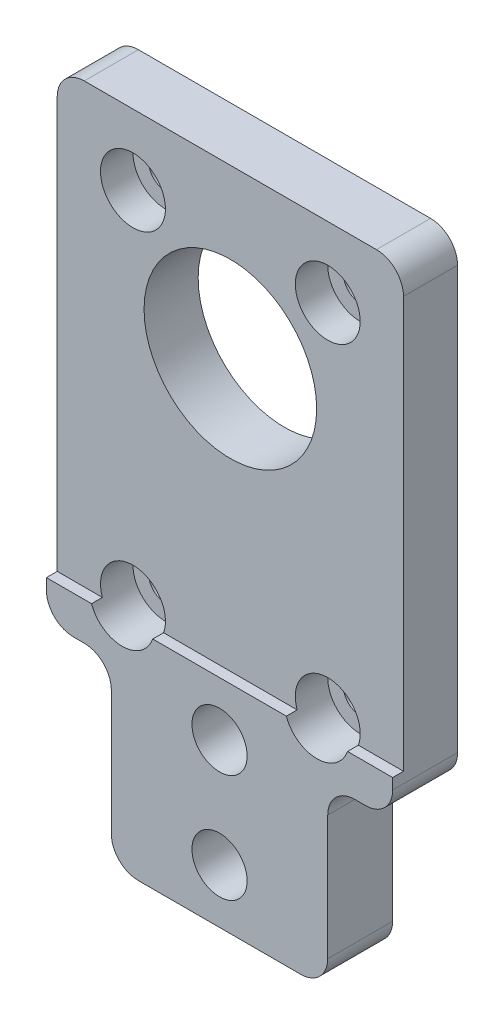
ISO-10303-21;
HEADER;
FILE_DESCRIPTION(('STEP AP214'),'2;1');
FILE_NAME('part.step','',(''),(''),'','','');
FILE_SCHEMA(('AUTOMOTIVE_DESIGN { 1 0 10303 214 1 1 1 1 }'));
ENDSEC;
DATA;
#1=APPLICATION_CONTEXT('core data for automotive mechanical design processes');
#2=APPLICATION_PROTOCOL_DEFINITION('international standard','automotive_design',2000,#1);
#3=PRODUCT_CONTEXT('',#1,'mechanical');
#4=PRODUCT('Part','Part','',(#3));
#5=PRODUCT_RELATED_PRODUCT_CATEGORY('part','',(#4));
#6=PRODUCT_DEFINITION_FORMATION('','',#4);
#7=PRODUCT_DEFINITION_CONTEXT('part definition',#1,'design');
#8=PRODUCT_DEFINITION('design','',#6,#7);
#9=PRODUCT_DEFINITION_SHAPE('','',#8);
#10=(LENGTH_UNIT() NAMED_UNIT(*) SI_UNIT(.MILLI.,.METRE.));
#11=(NAMED_UNIT(*) PLANE_ANGLE_UNIT() SI_UNIT($,.RADIAN.));
#12=(NAMED_UNIT(*) SI_UNIT($,.STERADIAN.) SOLID_ANGLE_UNIT());
#13=UNCERTAINTY_MEASURE_WITH_UNIT(LENGTH_MEASURE(1.E-05),#10,'distance_accuracy_value','');
#14=(GEOMETRIC_REPRESENTATION_CONTEXT(3) GLOBAL_UNCERTAINTY_ASSIGNED_CONTEXT((#13)) GLOBAL_UNIT_ASSIGNED_CONTEXT((#10,
#11,#12)) REPRESENTATION_CONTEXT('',''));
#15=CARTESIAN_POINT('',(0.,0.,0.));
#16=DIRECTION('',(0.,0.,1.));
#17=DIRECTION('',(1.,0.,0.));
#18=AXIS2_PLACEMENT_3D('',#15,#16,#17);
#19=CARTESIAN_POINT('',(-9.00000000000001,6.,0.));
#20=DIRECTION('',(0.,0.,1.));
#21=DIRECTION('',(1.,0.,0.));
#22=AXIS2_PLACEMENT_3D('',#19,#20,#21);
#23=CYLINDRICAL_SURFACE('',#22,1.55);
#24=CARTESIAN_POINT('',(-9.00000000000001,6.,0.));
#25=DIRECTION('',(0.,0.,1.));
#26=DIRECTION('',(1.,0.,0.));
#27=AXIS2_PLACEMENT_3D('',#24,#25,#26);
#28=CIRCLE('',#27,1.55);
#29=CARTESIAN_POINT('',(-7.45000000000001,6.,0.));
#30=VERTEX_POINT('',#29);
#31=EDGE_CURVE('E286',#30,#30,#28,.T.);
#32=ORIENTED_EDGE('',*,*,#31,.F.);
#33=EDGE_LOOP('',(#32));
#34=FACE_BOUND('',#33,.T.);
#35=CARTESIAN_POINT('',(-9.00000000000001,6.,2.));
#36=DIRECTION('',(0.,0.,1.));
#37=DIRECTION('',(1.,0.,0.));
#38=AXIS2_PLACEMENT_3D('',#35,#36,#37);
#39=CIRCLE('',#38,1.55);
#40=CARTESIAN_POINT('',(-7.45000000000001,6.,2.));
#41=VERTEX_POINT('',#40);
#42=EDGE_CURVE('E37',#41,#41,#39,.F.);
#43=ORIENTED_EDGE('',*,*,#42,.F.);
#44=EDGE_LOOP('',(#43));
#45=FACE_BOUND('',#44,.T.);
#46=ADVANCED_FACE('F33',(#34,#45),#23,.F.);
#47=CARTESIAN_POINT('',(8.9999999999999,6.,0.));
#48=DIRECTION('',(0.,0.,1.));
#49=DIRECTION('',(1.,0.,0.));
#50=AXIS2_PLACEMENT_3D('',#47,#48,#49);
#51=CYLINDRICAL_SURFACE('',#50,1.55);
#52=CARTESIAN_POINT('',(8.9999999999999,6.,0.));
#53=DIRECTION('',(0.,0.,1.));
#54=DIRECTION('',(1.,0.,0.));
#55=AXIS2_PLACEMENT_3D('',#52,#53,#54);
#56=CIRCLE('',#55,1.55);
#57=CARTESIAN_POINT('',(10.5499999999999,6.,0.));
#58=VERTEX_POINT('',#57);
#59=EDGE_CURVE('E289',#58,#58,#56,.T.);
#60=ORIENTED_EDGE('',*,*,#59,.F.);
#61=EDGE_LOOP('',(#60));
#62=FACE_BOUND('',#61,.T.);
#63=CARTESIAN_POINT('',(8.9999999999999,6.,2.));
#64=DIRECTION('',(0.,0.,1.));
#65=DIRECTION('',(1.,0.,0.));
#66=AXIS2_PLACEMENT_3D('',#63,#64,#65);
#67=CIRCLE('',#66,1.55);
#68=CARTESIAN_POINT('',(10.5499999999999,6.,2.));
#69=VERTEX_POINT('',#68);
#70=EDGE_CURVE('E236',#69,#69,#67,.F.);
#71=ORIENTED_EDGE('',*,*,#70,.F.);
#72=EDGE_LOOP('',(#71));
#73=FACE_BOUND('',#72,.T.);
#74=ADVANCED_FACE('F519',(#62,#73),#51,.F.);
#75=CARTESIAN_POINT('',(9.,38.9999999999999,0.));
#76=DIRECTION('',(0.,0.,1.));
#77=DIRECTION('',(1.,0.,0.));
#78=AXIS2_PLACEMENT_3D('',#75,#76,#77);
#79=CYLINDRICAL_SURFACE('',#78,1.55);
#80=CARTESIAN_POINT('',(9.,38.9999999999999,0.));
#81=DIRECTION('',(0.,0.,1.));
#82=DIRECTION('',(1.,0.,0.));
#83=AXIS2_PLACEMENT_3D('',#80,#81,#82);
#84=CIRCLE('',#83,1.55);
#85=CARTESIAN_POINT('',(10.55,38.9999999999999,0.));
#86=VERTEX_POINT('',#85);
#87=EDGE_CURVE('E292',#86,#86,#84,.T.);
#88=ORIENTED_EDGE('',*,*,#87,.F.);
#89=EDGE_LOOP('',(#88));
#90=FACE_BOUND('',#89,.T.);
#91=CARTESIAN_POINT('',(9.,38.9999999999999,2.));
#92=DIRECTION('',(0.,0.,1.));
#93=DIRECTION('',(1.,0.,0.));
#94=AXIS2_PLACEMENT_3D('',#91,#92,#93);
#95=CIRCLE('',#94,1.55);
#96=CARTESIAN_POINT('',(10.55,38.9999999999999,2.));
#97=VERTEX_POINT('',#96);
#98=EDGE_CURVE('E230',#97,#97,#95,.F.);
#99=ORIENTED_EDGE('',*,*,#98,.F.);
#100=EDGE_LOOP('',(#99));
#101=FACE_BOUND('',#100,.T.);
#102=ADVANCED_FACE('F525',(#90,#101),#79,.F.);
#103=CARTESIAN_POINT('',(-9.,39.,0.));
#104=DIRECTION('',(0.,0.,1.));
#105=DIRECTION('',(1.,0.,0.));
#106=AXIS2_PLACEMENT_3D('',#103,#104,#105);
#107=CYLINDRICAL_SURFACE('',#106,1.55);
#108=CARTESIAN_POINT('',(-9.,39.,0.));
#109=DIRECTION('',(0.,0.,1.));
#110=DIRECTION('',(1.,0.,0.));
#111=AXIS2_PLACEMENT_3D('',#108,#109,#110);
#112=CIRCLE('',#111,1.55);
#113=CARTESIAN_POINT('',(-7.45,39.,0.));
#114=VERTEX_POINT('',#113);
#115=EDGE_CURVE('E295',#114,#114,#112,.T.);
#116=ORIENTED_EDGE('',*,*,#115,.F.);
#117=EDGE_LOOP('',(#116));
#118=FACE_BOUND('',#117,.T.);
#119=CARTESIAN_POINT('',(-9.,39.,2.));
#120=DIRECTION('',(0.,0.,1.));
#121=DIRECTION('',(1.,0.,0.));
#122=AXIS2_PLACEMENT_3D('',#119,#120,#121);
#123=CIRCLE('',#122,1.55);
#124=CARTESIAN_POINT('',(-7.45,39.,2.));
#125=VERTEX_POINT('',#124);
#126=EDGE_CURVE('E212',#125,#125,#123,.F.);
#127=ORIENTED_EDGE('',*,*,#126,.F.);
#128=EDGE_LOOP('',(#127));
#129=FACE_BOUND('',#128,.T.);
#130=ADVANCED_FACE('F535',(#118,#129),#107,.F.);
#131=CARTESIAN_POINT('',(0.,30.,6.));
#132=DIRECTION('',(0.,0.,1.));
#133=DIRECTION('',(1.,0.,0.));
#134=AXIS2_PLACEMENT_3D('',#131,#132,#133);
#135=PLANE('',#134);
#136=CARTESIAN_POINT('',(0.,0.,6.));
#137=DIRECTION('',(0.,0.,1.));
#138=DIRECTION('',(1.,0.,0.));
#139=AXIS2_PLACEMENT_3D('',#136,#137,#138);
#140=CIRCLE('',#139,2.55);
#141=CARTESIAN_POINT('',(2.55,0.,6.));
#142=VERTEX_POINT('',#141);
#143=EDGE_CURVE('E329',#142,#142,#140,.T.);
#144=ORIENTED_EDGE('',*,*,#143,.F.);
#145=EDGE_LOOP('',(#144));
#146=FACE_BOUND('',#145,.T.);
#147=CARTESIAN_POINT('',(-9.00000000000001,6.,6.));
#148=DIRECTION('',(0.,0.,1.));
#149=DIRECTION('',(1.,0.,0.));
#150=AXIS2_PLACEMENT_3D('',#147,#148,#149);
#151=CIRCLE('',#150,3.);
#152=CARTESIAN_POINT('',(-11.8284271247462,5.,6.));
#153=VERTEX_POINT('',#152);
#154=CARTESIAN_POINT('',(-6.17157287525382,5.,6.));
#155=VERTEX_POINT('',#154);
#156=EDGE_CURVE('E184',#153,#155,#151,.T.);
#157=ORIENTED_EDGE('',*,*,#156,.F.);
#158=DIRECTION('',(1.,0.,0.));
#159=VECTOR('',#158,1.);
#160=CARTESIAN_POINT('',(-30.,5.,6.));
#161=LINE('',#160,#159);
#162=CARTESIAN_POINT('',(-16.,5.,6.));
#163=VERTEX_POINT('',#162);
#164=EDGE_CURVE('E197',#163,#153,#161,.T.);
#165=ORIENTED_EDGE('',*,*,#164,.F.);
#166=DIRECTION('',(0.,1.,0.));
#167=VECTOR('',#166,1.);
#168=CARTESIAN_POINT('',(-16.,45.5,6.));
#169=LINE('',#168,#167);
#170=CARTESIAN_POINT('',(-16.,4.,6.));
#171=VERTEX_POINT('',#170);
#172=EDGE_CURVE('E309',#171,#163,#169,.T.);
#173=ORIENTED_EDGE('',*,*,#172,.F.);
#174=CARTESIAN_POINT('',(-13.5,4.,6.));
#175=DIRECTION('',(0.,0.,1.));
#176=DIRECTION('',(1.,0.,0.));
#177=AXIS2_PLACEMENT_3D('',#174,#175,#176);
#178=CIRCLE('',#177,2.5);
#179=CARTESIAN_POINT('',(-13.5,1.5,6.));
#180=VERTEX_POINT('',#179);
#181=EDGE_CURVE('E377',#171,#180,#178,.T.);
#182=ORIENTED_EDGE('',*,*,#181,.T.);
#183=DIRECTION('',(-1.,0.,0.));
#184=VECTOR('',#183,1.);
#185=CARTESIAN_POINT('',(16.,1.5,6.));
#186=LINE('',#185,#184);
#187=CARTESIAN_POINT('',(-12.5,1.5,6.));
#188=VERTEX_POINT('',#187);
#189=EDGE_CURVE('E304',#188,#180,#186,.T.);
#190=ORIENTED_EDGE('',*,*,#189,.F.);
#191=CARTESIAN_POINT('',(-12.5,-0.999999999999999,6.));
#192=DIRECTION('',(0.,0.,1.));
#193=DIRECTION('',(1.,0.,0.));
#194=AXIS2_PLACEMENT_3D('',#191,#192,#193);
#195=CIRCLE('',#194,2.5);
#196=CARTESIAN_POINT('',(-10.,-1.,6.));
#197=VERTEX_POINT('',#196);
#198=EDGE_CURVE('E235',#188,#197,#195,.F.);
#199=ORIENTED_EDGE('',*,*,#198,.T.);
#200=DIRECTION('',(0.,-1.,0.));
#201=VECTOR('',#200,1.);
#202=CARTESIAN_POINT('',(-10.,-15.,6.));
#203=LINE('',#202,#201);
#204=CARTESIAN_POINT('',(-10.,-12.5,6.));
#205=VERTEX_POINT('',#204);
#206=EDGE_CURVE('E335',#197,#205,#203,.T.);
#207=ORIENTED_EDGE('',*,*,#206,.T.);
#208=CARTESIAN_POINT('',(-7.5,-12.5,6.));
#209=DIRECTION('',(0.,0.,1.));
#210=DIRECTION('',(1.,0.,0.));
#211=AXIS2_PLACEMENT_3D('',#208,#209,#210);
#212=CIRCLE('',#211,2.5);
#213=CARTESIAN_POINT('',(-7.5,-15.,6.));
#214=VERTEX_POINT('',#213);
#215=EDGE_CURVE('E375',#205,#214,#212,.T.);
#216=ORIENTED_EDGE('',*,*,#215,.T.);
#217=DIRECTION('',(1.,0.,0.));
#218=VECTOR('',#217,1.);
#219=CARTESIAN_POINT('',(10.,-15.,6.));
#220=LINE('',#219,#218);
#221=CARTESIAN_POINT('',(7.5,-15.,6.));
#222=VERTEX_POINT('',#221);
#223=EDGE_CURVE('E338',#214,#222,#220,.T.);
#224=ORIENTED_EDGE('',*,*,#223,.T.);
#225=CARTESIAN_POINT('',(7.5,-12.5,6.));
#226=DIRECTION('',(0.,0.,1.));
#227=DIRECTION('',(1.,0.,0.));
#228=AXIS2_PLACEMENT_3D('',#225,#226,#227);
#229=CIRCLE('',#228,2.5);
#230=CARTESIAN_POINT('',(10.,-12.5,6.));
#231=VERTEX_POINT('',#230);
#232=EDGE_CURVE('E379',#222,#231,#229,.T.);
#233=ORIENTED_EDGE('',*,*,#232,.T.);
#234=DIRECTION('',(0.,1.,0.));
#235=VECTOR('',#234,1.);
#236=CARTESIAN_POINT('',(10.,-15.,6.));
#237=LINE('',#236,#235);
#238=CARTESIAN_POINT('',(10.,-0.999999999999999,6.));
#239=VERTEX_POINT('',#238);
#240=EDGE_CURVE('E342',#231,#239,#237,.T.);
#241=ORIENTED_EDGE('',*,*,#240,.T.);
#242=CARTESIAN_POINT('',(12.5,-0.999999999999999,6.));
#243=DIRECTION('',(0.,0.,1.));
#244=DIRECTION('',(1.,0.,0.));
#245=AXIS2_PLACEMENT_3D('',#242,#243,#244);
#246=CIRCLE('',#245,2.5);
#247=CARTESIAN_POINT('',(12.5,1.5,6.));
#248=VERTEX_POINT('',#247);
#249=EDGE_CURVE('E413',#239,#248,#246,.F.);
#250=ORIENTED_EDGE('',*,*,#249,.T.);
#251=CARTESIAN_POINT('',(13.5,1.5,6.));
#252=VERTEX_POINT('',#251);
#253=EDGE_CURVE('E306',#252,#248,#186,.T.);
#254=ORIENTED_EDGE('',*,*,#253,.F.);
#255=CARTESIAN_POINT('',(13.5,4.,6.));
#256=DIRECTION('',(0.,0.,1.));
#257=DIRECTION('',(1.,0.,0.));
#258=AXIS2_PLACEMENT_3D('',#255,#256,#257);
#259=CIRCLE('',#258,2.5);
#260=CARTESIAN_POINT('',(16.,4.,6.));
#261=VERTEX_POINT('',#260);
#262=EDGE_CURVE('E381',#252,#261,#259,.T.);
#263=ORIENTED_EDGE('',*,*,#262,.T.);
#264=DIRECTION('',(0.,-1.,0.));
#265=VECTOR('',#264,1.);
#266=CARTESIAN_POINT('',(16.,45.5,6.));
#267=LINE('',#266,#265);
#268=CARTESIAN_POINT('',(16.,5.,6.));
#269=VERTEX_POINT('',#268);
#270=EDGE_CURVE('E302',#269,#261,#267,.T.);
#271=ORIENTED_EDGE('',*,*,#270,.F.);
#272=CARTESIAN_POINT('',(11.8284271247461,5.,6.));
#273=VERTEX_POINT('',#272);
#274=EDGE_CURVE('E207',#273,#269,#161,.T.);
#275=ORIENTED_EDGE('',*,*,#274,.F.);
#276=CARTESIAN_POINT('',(8.9999999999999,6.,6.));
#277=DIRECTION('',(0.,0.,1.));
#278=DIRECTION('',(1.,0.,0.));
#279=AXIS2_PLACEMENT_3D('',#276,#277,#278);
#280=CIRCLE('',#279,3.);
#281=CARTESIAN_POINT('',(6.17157287525371,5.,6.));
#282=VERTEX_POINT('',#281);
#283=EDGE_CURVE('E497',#282,#273,#280,.T.);
#284=ORIENTED_EDGE('',*,*,#283,.F.);
#285=EDGE_CURVE('E200',#155,#282,#161,.T.);
#286=ORIENTED_EDGE('',*,*,#285,.F.);
#287=EDGE_LOOP('',(#157,#165,#173,#182,#190,#199,#207,#216,#224,#233,#241,#250,#254,#263,#271,
#275,#284,#286));
#288=FACE_BOUND('',#287,.T.);
#289=CARTESIAN_POINT('',(0.,-10.,6.));
#290=DIRECTION('',(0.,0.,1.));
#291=DIRECTION('',(1.,0.,0.));
#292=AXIS2_PLACEMENT_3D('',#289,#290,#291);
#293=CIRCLE('',#292,2.55);
#294=CARTESIAN_POINT('',(2.55,-10.,6.));
#295=VERTEX_POINT('',#294);
#296=EDGE_CURVE('E323',#295,#295,#293,.T.);
#297=ORIENTED_EDGE('',*,*,#296,.F.);
#298=EDGE_LOOP('',(#297));
#299=FACE_BOUND('',#298,.T.);
#300=ADVANCED_FACE('F194',(#146,#288,#299),#135,.T.);
#301=CARTESIAN_POINT('',(0.,30.,0.));
#302=DIRECTION('',(0.,0.,1.));
#303=DIRECTION('',(1.,0.,0.));
#304=AXIS2_PLACEMENT_3D('',#301,#302,#303);
#305=PLANE('',#304);
#306=ORIENTED_EDGE('',*,*,#31,.T.);
#307=EDGE_LOOP('',(#306));
#308=FACE_BOUND('',#307,.T.);
#309=ORIENTED_EDGE('',*,*,#59,.T.);
#310=EDGE_LOOP('',(#309));
#311=FACE_BOUND('',#310,.T.);
#312=ORIENTED_EDGE('',*,*,#87,.T.);
#313=EDGE_LOOP('',(#312));
#314=FACE_BOUND('',#313,.T.);
#315=ORIENTED_EDGE('',*,*,#115,.T.);
#316=EDGE_LOOP('',(#315));
#317=FACE_BOUND('',#316,.T.);
#318=CARTESIAN_POINT('',(0.,30.,0.));
#319=DIRECTION('',(0.,0.,1.));
#320=DIRECTION('',(1.,0.,0.));
#321=AXIS2_PLACEMENT_3D('',#318,#319,#320);
#322=CIRCLE('',#321,7.975);
#323=CARTESIAN_POINT('',(7.975,30.,0.));
#324=VERTEX_POINT('',#323);
#325=EDGE_CURVE('E298',#324,#324,#322,.T.);
#326=ORIENTED_EDGE('',*,*,#325,.T.);
#327=EDGE_LOOP('',(#326));
#328=FACE_BOUND('',#327,.T.);
#329=CARTESIAN_POINT('',(0.,0.,0.));
#330=DIRECTION('',(0.,0.,1.));
#331=DIRECTION('',(1.,0.,0.));
#332=AXIS2_PLACEMENT_3D('',#329,#330,#331);
#333=CIRCLE('',#332,2.55);
#334=CARTESIAN_POINT('',(2.55,0.,0.));
#335=VERTEX_POINT('',#334);
#336=EDGE_CURVE('E326',#335,#335,#333,.T.);
#337=ORIENTED_EDGE('',*,*,#336,.T.);
#338=EDGE_LOOP('',(#337));
#339=FACE_BOUND('',#338,.T.);
#340=DIRECTION('',(1.,0.,0.));
#341=VECTOR('',#340,1.);
#342=CARTESIAN_POINT('',(16.,45.5,0.));
#343=LINE('',#342,#341);
#344=CARTESIAN_POINT('',(-13.5,45.5,0.));
#345=VERTEX_POINT('',#344);
#346=CARTESIAN_POINT('',(13.5,45.5,0.));
#347=VERTEX_POINT('',#346);
#348=EDGE_CURVE('E305',#345,#347,#343,.T.);
#349=ORIENTED_EDGE('',*,*,#348,.T.);
#350=CARTESIAN_POINT('',(13.5,43.,0.));
#351=DIRECTION('',(0.,0.,1.));
#352=DIRECTION('',(1.,0.,0.));
#353=AXIS2_PLACEMENT_3D('',#350,#351,#352);
#354=CIRCLE('',#353,2.5);
#355=CARTESIAN_POINT('',(16.,43.,0.));
#356=VERTEX_POINT('',#355);
#357=EDGE_CURVE('E367',#347,#356,#354,.F.);
#358=ORIENTED_EDGE('',*,*,#357,.T.);
#359=DIRECTION('',(0.,-1.,0.));
#360=VECTOR('',#359,1.);
#361=CARTESIAN_POINT('',(16.,45.5,0.));
#362=LINE('',#361,#360);
#363=CARTESIAN_POINT('',(16.,4.,0.));
#364=VERTEX_POINT('',#363);
#365=EDGE_CURVE('E301',#356,#364,#362,.T.);
#366=ORIENTED_EDGE('',*,*,#365,.T.);
#367=CARTESIAN_POINT('',(13.5,4.,0.));
#368=DIRECTION('',(0.,0.,1.));
#369=DIRECTION('',(1.,0.,0.));
#370=AXIS2_PLACEMENT_3D('',#367,#368,#369);
#371=CIRCLE('',#370,2.5);
#372=CARTESIAN_POINT('',(13.5,1.5,0.));
#373=VERTEX_POINT('',#372);
#374=EDGE_CURVE('E365',#364,#373,#371,.F.);
#375=ORIENTED_EDGE('',*,*,#374,.T.);
#376=DIRECTION('',(-1.,0.,0.));
#377=VECTOR('',#376,1.);
#378=CARTESIAN_POINT('',(16.,1.5,0.));
#379=LINE('',#378,#377);
#380=CARTESIAN_POINT('',(12.5,1.5,0.));
#381=VERTEX_POINT('',#380);
#382=EDGE_CURVE('E315',#373,#381,#379,.T.);
#383=ORIENTED_EDGE('',*,*,#382,.T.);
#384=CARTESIAN_POINT('',(12.5,-0.999999999999999,0.));
#385=DIRECTION('',(0.,0.,1.));
#386=DIRECTION('',(1.,0.,0.));
#387=AXIS2_PLACEMENT_3D('',#384,#385,#386);
#388=CIRCLE('',#387,2.5);
#389=CARTESIAN_POINT('',(10.,-0.999999999999999,0.));
#390=VERTEX_POINT('',#389);
#391=EDGE_CURVE('E415',#381,#390,#388,.T.);
#392=ORIENTED_EDGE('',*,*,#391,.T.);
#393=DIRECTION('',(0.,1.,0.));
#394=VECTOR('',#393,1.);
#395=CARTESIAN_POINT('',(10.,-15.,0.));
#396=LINE('',#395,#394);
#397=CARTESIAN_POINT('',(10.,-12.5,0.));
#398=VERTEX_POINT('',#397);
#399=EDGE_CURVE('E339',#398,#390,#396,.T.);
#400=ORIENTED_EDGE('',*,*,#399,.F.);
#401=CARTESIAN_POINT('',(7.5,-12.5,0.));
#402=DIRECTION('',(0.,0.,1.));
#403=DIRECTION('',(1.,0.,0.));
#404=AXIS2_PLACEMENT_3D('',#401,#402,#403);
#405=CIRCLE('',#404,2.5);
#406=CARTESIAN_POINT('',(7.5,-15.,0.));
#407=VERTEX_POINT('',#406);
#408=EDGE_CURVE('E363',#398,#407,#405,.F.);
#409=ORIENTED_EDGE('',*,*,#408,.T.);
#410=DIRECTION('',(1.,0.,0.));
#411=VECTOR('',#410,1.);
#412=CARTESIAN_POINT('',(10.,-15.,0.));
#413=LINE('',#412,#411);
#414=CARTESIAN_POINT('',(-7.5,-15.,0.));
#415=VERTEX_POINT('',#414);
#416=EDGE_CURVE('E348',#415,#407,#413,.T.);
#417=ORIENTED_EDGE('',*,*,#416,.F.);
#418=CARTESIAN_POINT('',(-7.5,-12.5,0.));
#419=DIRECTION('',(0.,0.,1.));
#420=DIRECTION('',(1.,0.,0.));
#421=AXIS2_PLACEMENT_3D('',#418,#419,#420);
#422=CIRCLE('',#421,2.5);
#423=CARTESIAN_POINT('',(-10.,-12.5,0.));
#424=VERTEX_POINT('',#423);
#425=EDGE_CURVE('E357',#415,#424,#422,.F.);
#426=ORIENTED_EDGE('',*,*,#425,.T.);
#427=DIRECTION('',(0.,-1.,0.));
#428=VECTOR('',#427,1.);
#429=CARTESIAN_POINT('',(-10.,-15.,0.));
#430=LINE('',#429,#428);
#431=CARTESIAN_POINT('',(-10.,-1.,0.));
#432=VERTEX_POINT('',#431);
#433=EDGE_CURVE('E332',#432,#424,#430,.T.);
#434=ORIENTED_EDGE('',*,*,#433,.F.);
#435=CARTESIAN_POINT('',(-12.5,-0.999999999999999,0.));
#436=DIRECTION('',(0.,0.,1.));
#437=DIRECTION('',(1.,0.,0.));
#438=AXIS2_PLACEMENT_3D('',#435,#436,#437);
#439=CIRCLE('',#438,2.5);
#440=CARTESIAN_POINT('',(-12.5,1.5,0.));
#441=VERTEX_POINT('',#440);
#442=EDGE_CURVE('E417',#432,#441,#439,.T.);
#443=ORIENTED_EDGE('',*,*,#442,.T.);
#444=CARTESIAN_POINT('',(-13.5,1.5,0.));
#445=VERTEX_POINT('',#444);
#446=EDGE_CURVE('E314',#441,#445,#379,.T.);
#447=ORIENTED_EDGE('',*,*,#446,.T.);
#448=CARTESIAN_POINT('',(-13.5,4.,0.));
#449=DIRECTION('',(0.,0.,1.));
#450=DIRECTION('',(1.,0.,0.));
#451=AXIS2_PLACEMENT_3D('',#448,#449,#450);
#452=CIRCLE('',#451,2.5);
#453=CARTESIAN_POINT('',(-16.,4.,0.));
#454=VERTEX_POINT('',#453);
#455=EDGE_CURVE('E359',#445,#454,#452,.F.);
#456=ORIENTED_EDGE('',*,*,#455,.T.);
#457=DIRECTION('',(0.,1.,0.));
#458=VECTOR('',#457,1.);
#459=CARTESIAN_POINT('',(-16.,45.5,0.));
#460=LINE('',#459,#458);
#461=CARTESIAN_POINT('',(-16.,43.,0.));
#462=VERTEX_POINT('',#461);
#463=EDGE_CURVE('E318',#454,#462,#460,.T.);
#464=ORIENTED_EDGE('',*,*,#463,.T.);
#465=CARTESIAN_POINT('',(-13.5,43.,0.));
#466=DIRECTION('',(0.,0.,1.));
#467=DIRECTION('',(1.,0.,0.));
#468=AXIS2_PLACEMENT_3D('',#465,#466,#467);
#469=CIRCLE('',#468,2.5);
#470=EDGE_CURVE('E361',#462,#345,#469,.F.);
#471=ORIENTED_EDGE('',*,*,#470,.T.);
#472=EDGE_LOOP('',(#349,#358,#366,#375,#383,#392,#400,#409,#417,#426,#434,#443,#447,#456,#464,#471));
#473=FACE_BOUND('',#472,.T.);
#474=CARTESIAN_POINT('',(0.,-10.,0.));
#475=DIRECTION('',(0.,0.,1.));
#476=DIRECTION('',(1.,0.,0.));
#477=AXIS2_PLACEMENT_3D('',#474,#475,#476);
#478=CIRCLE('',#477,2.55);
#479=CARTESIAN_POINT('',(2.55,-10.,0.));
#480=VERTEX_POINT('',#479);
#481=EDGE_CURVE('E311',#480,#480,#478,.T.);
#482=ORIENTED_EDGE('',*,*,#481,.T.);
#483=EDGE_LOOP('',(#482));
#484=FACE_BOUND('',#483,.T.);
#485=ADVANCED_FACE('F434',(#308,#311,#314,#317,#328,#339,#473,#484),#305,.F.);
#486=CARTESIAN_POINT('',(-10.,-15.,6.));
#487=DIRECTION('',(1.,0.,0.));
#488=DIRECTION('',(0.,0.,-1.));
#489=AXIS2_PLACEMENT_3D('',#486,#487,#488);
#490=PLANE('',#489);
#491=ORIENTED_EDGE('',*,*,#206,.F.);
#492=DIRECTION('',(0.,0.,-1.));
#493=VECTOR('',#492,1.);
#494=CARTESIAN_POINT('',(-10.,-0.999999999999999,6.));
#495=LINE('',#494,#493);
#496=EDGE_CURVE('E410',#197,#432,#495,.T.);
#497=ORIENTED_EDGE('',*,*,#496,.T.);
#498=ORIENTED_EDGE('',*,*,#433,.T.);
#499=DIRECTION('',(0.,0.,-1.));
#500=VECTOR('',#499,1.);
#501=CARTESIAN_POINT('',(-10.,-12.5,6.));
#502=LINE('',#501,#500);
#503=EDGE_CURVE('E408',#424,#205,#502,.F.);
#504=ORIENTED_EDGE('',*,*,#503,.T.);
#505=EDGE_LOOP('',(#491,#497,#498,#504));
#506=FACE_BOUND('',#505,.T.);
#507=ADVANCED_FACE('F427',(#506),#490,.F.);
#508=CARTESIAN_POINT('',(10.,-15.,6.));
#509=DIRECTION('',(0.,1.,0.));
#510=DIRECTION('',(-1.,0.,0.));
#511=AXIS2_PLACEMENT_3D('',#508,#509,#510);
#512=PLANE('',#511);
#513=ORIENTED_EDGE('',*,*,#416,.T.);
#514=DIRECTION('',(0.,0.,-1.));
#515=VECTOR('',#514,1.);
#516=CARTESIAN_POINT('',(7.5,-15.,6.));
#517=LINE('',#516,#515);
#518=EDGE_CURVE('E397',#407,#222,#517,.F.);
#519=ORIENTED_EDGE('',*,*,#518,.T.);
#520=ORIENTED_EDGE('',*,*,#223,.F.);
#521=DIRECTION('',(0.,0.,-1.));
#522=VECTOR('',#521,1.);
#523=CARTESIAN_POINT('',(-7.5,-15.,6.));
#524=LINE('',#523,#522);
#525=EDGE_CURVE('E394',#214,#415,#524,.T.);
#526=ORIENTED_EDGE('',*,*,#525,.T.);
#527=EDGE_LOOP('',(#513,#519,#520,#526));
#528=FACE_BOUND('',#527,.T.);
#529=ADVANCED_FACE('F493',(#528),#512,.F.);
#530=CARTESIAN_POINT('',(10.,-15.,6.));
#531=DIRECTION('',(-1.,0.,0.));
#532=DIRECTION('',(0.,0.,1.));
#533=AXIS2_PLACEMENT_3D('',#530,#531,#532);
#534=PLANE('',#533);
#535=ORIENTED_EDGE('',*,*,#399,.T.);
#536=DIRECTION('',(0.,0.,1.));
#537=VECTOR('',#536,1.);
#538=CARTESIAN_POINT('',(10.,-0.999999999999999,6.));
#539=LINE('',#538,#537);
#540=EDGE_CURVE('E387',#390,#239,#539,.T.);
#541=ORIENTED_EDGE('',*,*,#540,.T.);
#542=ORIENTED_EDGE('',*,*,#240,.F.);
#543=DIRECTION('',(0.,0.,-1.));
#544=VECTOR('',#543,1.);
#545=CARTESIAN_POINT('',(10.,-12.5,6.));
#546=LINE('',#545,#544);
#547=EDGE_CURVE('E384',#231,#398,#546,.T.);
#548=ORIENTED_EDGE('',*,*,#547,.T.);
#549=EDGE_LOOP('',(#535,#541,#542,#548));
#550=FACE_BOUND('',#549,.T.);
#551=ADVANCED_FACE('F484',(#550),#534,.F.);
#552=CARTESIAN_POINT('',(0.,0.,6.));
#553=DIRECTION('',(0.,0.,-1.));
#554=DIRECTION('',(-1.,0.,0.));
#555=AXIS2_PLACEMENT_3D('',#552,#553,#554);
#556=CYLINDRICAL_SURFACE('',#555,2.55);
#557=ORIENTED_EDGE('',*,*,#143,.T.);
#558=EDGE_LOOP('',(#557));
#559=FACE_BOUND('',#558,.T.);
#560=ORIENTED_EDGE('',*,*,#336,.F.);
#561=EDGE_LOOP('',(#560));
#562=FACE_BOUND('',#561,.T.);
#563=ADVANCED_FACE('F554',(#559,#562),#556,.F.);
#564=CARTESIAN_POINT('',(0.,-10.,6.));
#565=DIRECTION('',(0.,0.,-1.));
#566=DIRECTION('',(-1.,0.,0.));
#567=AXIS2_PLACEMENT_3D('',#564,#565,#566);
#568=CYLINDRICAL_SURFACE('',#567,2.55);
#569=ORIENTED_EDGE('',*,*,#296,.T.);
#570=EDGE_LOOP('',(#569));
#571=FACE_BOUND('',#570,.T.);
#572=ORIENTED_EDGE('',*,*,#481,.F.);
#573=EDGE_LOOP('',(#572));
#574=FACE_BOUND('',#573,.T.);
#575=ADVANCED_FACE('F549',(#571,#574),#568,.F.);
#576=CARTESIAN_POINT('',(16.,1.5,6.));
#577=DIRECTION('',(0.,-1.,0.));
#578=DIRECTION('',(0.,0.,-1.));
#579=AXIS2_PLACEMENT_3D('',#576,#577,#578);
#580=PLANE('',#579);
#581=ORIENTED_EDGE('',*,*,#189,.T.);
#582=DIRECTION('',(0.,0.,-1.));
#583=VECTOR('',#582,1.);
#584=CARTESIAN_POINT('',(-13.5,1.5,6.));
#585=LINE('',#584,#583);
#586=EDGE_CURVE('E405',#180,#445,#585,.T.);
#587=ORIENTED_EDGE('',*,*,#586,.T.);
#588=ORIENTED_EDGE('',*,*,#446,.F.);
#589=DIRECTION('',(0.,0.,-1.));
#590=VECTOR('',#589,1.);
#591=CARTESIAN_POINT('',(-12.5,1.5,6.));
#592=LINE('',#591,#590);
#593=EDGE_CURVE('E403',#441,#188,#592,.F.);
#594=ORIENTED_EDGE('',*,*,#593,.T.);
#595=EDGE_LOOP('',(#581,#587,#588,#594));
#596=FACE_BOUND('',#595,.T.);
#597=ADVANCED_FACE('F437',(#596),#580,.T.);
#598=ORIENTED_EDGE('',*,*,#253,.T.);
#599=DIRECTION('',(0.,0.,1.));
#600=VECTOR('',#599,1.);
#601=CARTESIAN_POINT('',(12.5,1.5,6.));
#602=LINE('',#601,#600);
#603=EDGE_CURVE('E392',#248,#381,#602,.F.);
#604=ORIENTED_EDGE('',*,*,#603,.T.);
#605=ORIENTED_EDGE('',*,*,#382,.F.);
#606=DIRECTION('',(0.,0.,-1.));
#607=VECTOR('',#606,1.);
#608=CARTESIAN_POINT('',(13.5,1.5,6.));
#609=LINE('',#608,#607);
#610=EDGE_CURVE('E390',#373,#252,#609,.F.);
#611=ORIENTED_EDGE('',*,*,#610,.T.);
#612=EDGE_LOOP('',(#598,#604,#605,#611));
#613=FACE_BOUND('',#612,.T.);
#614=ADVANCED_FACE('F476',(#613),#580,.T.);
#615=CARTESIAN_POINT('',(16.,45.5,6.));
#616=DIRECTION('',(1.,0.,0.));
#617=DIRECTION('',(0.,1.,0.));
#618=AXIS2_PLACEMENT_3D('',#615,#616,#617);
#619=PLANE('',#618);
#620=DIRECTION('',(0.,0.,-1.));
#621=VECTOR('',#620,1.);
#622=CARTESIAN_POINT('',(16.,5.,6.));
#623=LINE('',#622,#621);
#624=CARTESIAN_POINT('',(16.,5.,5.));
#625=VERTEX_POINT('',#624);
#626=EDGE_CURVE('E284',#269,#625,#623,.T.);
#627=ORIENTED_EDGE('',*,*,#626,.F.);
#628=ORIENTED_EDGE('',*,*,#270,.T.);
#629=DIRECTION('',(0.,0.,-1.));
#630=VECTOR('',#629,1.);
#631=CARTESIAN_POINT('',(16.,4.,6.));
#632=LINE('',#631,#630);
#633=EDGE_CURVE('E369',#261,#364,#632,.T.);
#634=ORIENTED_EDGE('',*,*,#633,.T.);
#635=ORIENTED_EDGE('',*,*,#365,.F.);
#636=DIRECTION('',(0.,0.,-1.));
#637=VECTOR('',#636,1.);
#638=CARTESIAN_POINT('',(16.,43.,6.));
#639=LINE('',#638,#637);
#640=CARTESIAN_POINT('',(16.,43.,5.));
#641=VERTEX_POINT('',#640);
#642=EDGE_CURVE('E372',#356,#641,#639,.F.);
#643=ORIENTED_EDGE('',*,*,#642,.T.);
#644=DIRECTION('',(0.,1.,0.));
#645=VECTOR('',#644,1.);
#646=CARTESIAN_POINT('',(16.,45.5,5.));
#647=LINE('',#646,#645);
#648=EDGE_CURVE('E281',#625,#641,#647,.T.);
#649=ORIENTED_EDGE('',*,*,#648,.F.);
#650=EDGE_LOOP('',(#627,#628,#634,#635,#643,#649));
#651=FACE_BOUND('',#650,.T.);
#652=ADVANCED_FACE('F465',(#651),#619,.T.);
#653=CARTESIAN_POINT('',(16.,45.5,6.));
#654=DIRECTION('',(0.,1.,0.));
#655=DIRECTION('',(0.,0.,1.));
#656=AXIS2_PLACEMENT_3D('',#653,#654,#655);
#657=PLANE('',#656);
#658=DIRECTION('',(-1.,0.,0.));
#659=VECTOR('',#658,1.);
#660=CARTESIAN_POINT('',(16.,45.5,5.));
#661=LINE('',#660,#659);
#662=CARTESIAN_POINT('',(13.5,45.5,5.));
#663=VERTEX_POINT('',#662);
#664=CARTESIAN_POINT('',(-13.5,45.5,5.));
#665=VERTEX_POINT('',#664);
#666=EDGE_CURVE('E277',#663,#665,#661,.T.);
#667=ORIENTED_EDGE('',*,*,#666,.F.);
#668=DIRECTION('',(0.,0.,-1.));
#669=VECTOR('',#668,1.);
#670=CARTESIAN_POINT('',(13.5,45.5,6.));
#671=LINE('',#670,#669);
#672=EDGE_CURVE('E355',#663,#347,#671,.T.);
#673=ORIENTED_EDGE('',*,*,#672,.T.);
#674=ORIENTED_EDGE('',*,*,#348,.F.);
#675=DIRECTION('',(0.,0.,-1.));
#676=VECTOR('',#675,1.);
#677=CARTESIAN_POINT('',(-13.5,45.5,6.));
#678=LINE('',#677,#676);
#679=EDGE_CURVE('E345',#345,#665,#678,.F.);
#680=ORIENTED_EDGE('',*,*,#679,.T.);
#681=EDGE_LOOP('',(#667,#673,#674,#680));
#682=FACE_BOUND('',#681,.T.);
#683=ADVANCED_FACE('F456',(#682),#657,.T.);
#684=CARTESIAN_POINT('',(-16.,45.5,6.));
#685=DIRECTION('',(-1.,0.,0.));
#686=DIRECTION('',(0.,-1.,0.));
#687=AXIS2_PLACEMENT_3D('',#684,#685,#686);
#688=PLANE('',#687);
#689=DIRECTION('',(0.,0.,1.));
#690=VECTOR('',#689,1.);
#691=CARTESIAN_POINT('',(-16.,5.,6.));
#692=LINE('',#691,#690);
#693=CARTESIAN_POINT('',(-16.,5.,5.));
#694=VERTEX_POINT('',#693);
#695=EDGE_CURVE('E204',#694,#163,#692,.T.);
#696=ORIENTED_EDGE('',*,*,#695,.F.);
#697=DIRECTION('',(0.,-1.,0.));
#698=VECTOR('',#697,1.);
#699=CARTESIAN_POINT('',(-16.,45.5,5.));
#700=LINE('',#699,#698);
#701=CARTESIAN_POINT('',(-16.,43.,5.));
#702=VERTEX_POINT('',#701);
#703=EDGE_CURVE('E273',#702,#694,#700,.T.);
#704=ORIENTED_EDGE('',*,*,#703,.F.);
#705=DIRECTION('',(0.,0.,-1.));
#706=VECTOR('',#705,1.);
#707=CARTESIAN_POINT('',(-16.,43.,6.));
#708=LINE('',#707,#706);
#709=EDGE_CURVE('E401',#702,#462,#708,.T.);
#710=ORIENTED_EDGE('',*,*,#709,.T.);
#711=ORIENTED_EDGE('',*,*,#463,.F.);
#712=DIRECTION('',(0.,0.,-1.));
#713=VECTOR('',#712,1.);
#714=CARTESIAN_POINT('',(-16.,4.,6.));
#715=LINE('',#714,#713);
#716=EDGE_CURVE('E399',#454,#171,#715,.F.);
#717=ORIENTED_EDGE('',*,*,#716,.T.);
#718=ORIENTED_EDGE('',*,*,#172,.T.);
#719=EDGE_LOOP('',(#696,#704,#710,#711,#717,#718));
#720=FACE_BOUND('',#719,.T.);
#721=ADVANCED_FACE('F445',(#720),#688,.T.);
#722=CARTESIAN_POINT('',(13.5,43.,6.));
#723=DIRECTION('',(0.,0.,-1.));
#724=DIRECTION('',(-1.,0.,0.));
#725=AXIS2_PLACEMENT_3D('',#722,#723,#724);
#726=CYLINDRICAL_SURFACE('',#725,2.5);
#727=CARTESIAN_POINT('',(13.5,43.,5.));
#728=DIRECTION('',(0.,0.,-1.));
#729=DIRECTION('',(-1.,0.,0.));
#730=AXIS2_PLACEMENT_3D('',#727,#728,#729);
#731=CIRCLE('',#730,2.5);
#732=EDGE_CURVE('E279',#641,#663,#731,.F.);
#733=ORIENTED_EDGE('',*,*,#732,.F.);
#734=ORIENTED_EDGE('',*,*,#642,.F.);
#735=ORIENTED_EDGE('',*,*,#357,.F.);
#736=ORIENTED_EDGE('',*,*,#672,.F.);
#737=EDGE_LOOP('',(#733,#734,#735,#736));
#738=FACE_BOUND('',#737,.T.);
#739=ADVANCED_FACE('F462',(#738),#726,.T.);
#740=CARTESIAN_POINT('',(12.5,-0.999999999999999,6.));
#741=DIRECTION('',(0.,0.,1.));
#742=DIRECTION('',(1.,0.,0.));
#743=AXIS2_PLACEMENT_3D('',#740,#741,#742);
#744=CYLINDRICAL_SURFACE('',#743,2.5);
#745=ORIENTED_EDGE('',*,*,#391,.F.);
#746=ORIENTED_EDGE('',*,*,#603,.F.);
#747=ORIENTED_EDGE('',*,*,#249,.F.);
#748=ORIENTED_EDGE('',*,*,#540,.F.);
#749=EDGE_LOOP('',(#745,#746,#747,#748));
#750=FACE_BOUND('',#749,.T.);
#751=ADVANCED_FACE('F480',(#750),#744,.F.);
#752=CARTESIAN_POINT('',(13.5,4.,6.));
#753=DIRECTION('',(0.,0.,-1.));
#754=DIRECTION('',(-1.,0.,0.));
#755=AXIS2_PLACEMENT_3D('',#752,#753,#754);
#756=CYLINDRICAL_SURFACE('',#755,2.5);
#757=ORIENTED_EDGE('',*,*,#262,.F.);
#758=ORIENTED_EDGE('',*,*,#610,.F.);
#759=ORIENTED_EDGE('',*,*,#374,.F.);
#760=ORIENTED_EDGE('',*,*,#633,.F.);
#761=EDGE_LOOP('',(#757,#758,#759,#760));
#762=FACE_BOUND('',#761,.T.);
#763=ADVANCED_FACE('F471',(#762),#756,.T.);
#764=CARTESIAN_POINT('',(7.5,-12.5,6.));
#765=DIRECTION('',(0.,0.,-1.));
#766=DIRECTION('',(-1.,0.,0.));
#767=AXIS2_PLACEMENT_3D('',#764,#765,#766);
#768=CYLINDRICAL_SURFACE('',#767,2.5);
#769=ORIENTED_EDGE('',*,*,#232,.F.);
#770=ORIENTED_EDGE('',*,*,#518,.F.);
#771=ORIENTED_EDGE('',*,*,#408,.F.);
#772=ORIENTED_EDGE('',*,*,#547,.F.);
#773=EDGE_LOOP('',(#769,#770,#771,#772));
#774=FACE_BOUND('',#773,.T.);
#775=ADVANCED_FACE('F489',(#774),#768,.T.);
#776=CARTESIAN_POINT('',(-13.5,43.,6.));
#777=DIRECTION('',(0.,0.,-1.));
#778=DIRECTION('',(-1.,0.,0.));
#779=AXIS2_PLACEMENT_3D('',#776,#777,#778);
#780=CYLINDRICAL_SURFACE('',#779,2.5);
#781=CARTESIAN_POINT('',(-13.5,43.,5.));
#782=DIRECTION('',(0.,0.,-1.));
#783=DIRECTION('',(-1.,0.,0.));
#784=AXIS2_PLACEMENT_3D('',#781,#782,#783);
#785=CIRCLE('',#784,2.5);
#786=EDGE_CURVE('E272',#665,#702,#785,.F.);
#787=ORIENTED_EDGE('',*,*,#786,.F.);
#788=ORIENTED_EDGE('',*,*,#679,.F.);
#789=ORIENTED_EDGE('',*,*,#470,.F.);
#790=ORIENTED_EDGE('',*,*,#709,.F.);
#791=EDGE_LOOP('',(#787,#788,#789,#790));
#792=FACE_BOUND('',#791,.T.);
#793=ADVANCED_FACE('F452',(#792),#780,.T.);
#794=CARTESIAN_POINT('',(-13.5,4.,6.));
#795=DIRECTION('',(0.,0.,-1.));
#796=DIRECTION('',(-1.,0.,0.));
#797=AXIS2_PLACEMENT_3D('',#794,#795,#796);
#798=CYLINDRICAL_SURFACE('',#797,2.5);
#799=ORIENTED_EDGE('',*,*,#181,.F.);
#800=ORIENTED_EDGE('',*,*,#716,.F.);
#801=ORIENTED_EDGE('',*,*,#455,.F.);
#802=ORIENTED_EDGE('',*,*,#586,.F.);
#803=EDGE_LOOP('',(#799,#800,#801,#802));
#804=FACE_BOUND('',#803,.T.);
#805=ADVANCED_FACE('F441',(#804),#798,.T.);
#806=CARTESIAN_POINT('',(-12.5,-0.999999999999999,6.));
#807=DIRECTION('',(0.,0.,-1.));
#808=DIRECTION('',(-1.,0.,0.));
#809=AXIS2_PLACEMENT_3D('',#806,#807,#808);
#810=CYLINDRICAL_SURFACE('',#809,2.5);
#811=ORIENTED_EDGE('',*,*,#198,.F.);
#812=ORIENTED_EDGE('',*,*,#593,.F.);
#813=ORIENTED_EDGE('',*,*,#442,.F.);
#814=ORIENTED_EDGE('',*,*,#496,.F.);
#815=EDGE_LOOP('',(#811,#812,#813,#814));
#816=FACE_BOUND('',#815,.T.);
#817=ADVANCED_FACE('F430',(#816),#810,.F.);
#818=CARTESIAN_POINT('',(-7.5,-12.5,6.));
#819=DIRECTION('',(0.,0.,-1.));
#820=DIRECTION('',(-1.,0.,0.));
#821=AXIS2_PLACEMENT_3D('',#818,#819,#820);
#822=CYLINDRICAL_SURFACE('',#821,2.5);
#823=ORIENTED_EDGE('',*,*,#215,.F.);
#824=ORIENTED_EDGE('',*,*,#503,.F.);
#825=ORIENTED_EDGE('',*,*,#425,.F.);
#826=ORIENTED_EDGE('',*,*,#525,.F.);
#827=EDGE_LOOP('',(#823,#824,#825,#826));
#828=FACE_BOUND('',#827,.T.);
#829=ADVANCED_FACE('F35',(#828),#822,.T.);
#830=CARTESIAN_POINT('',(0.,30.,0.));
#831=DIRECTION('',(0.,0.,1.));
#832=DIRECTION('',(1.,0.,0.));
#833=AXIS2_PLACEMENT_3D('',#830,#831,#832);
#834=CYLINDRICAL_SURFACE('',#833,7.975);
#835=CARTESIAN_POINT('',(0.,30.,5.));
#836=DIRECTION('',(0.,0.,-1.));
#837=DIRECTION('',(-1.,0.,0.));
#838=AXIS2_PLACEMENT_3D('',#835,#836,#837);
#839=CIRCLE('',#838,7.975);
#840=CARTESIAN_POINT('',(-7.975,30.,5.));
#841=VERTEX_POINT('',#840);
#842=EDGE_CURVE('E270',#841,#841,#839,.F.);
#843=ORIENTED_EDGE('',*,*,#842,.T.);
#844=EDGE_LOOP('',(#843));
#845=FACE_BOUND('',#844,.T.);
#846=ORIENTED_EDGE('',*,*,#325,.F.);
#847=EDGE_LOOP('',(#846));
#848=FACE_BOUND('',#847,.T.);
#849=ADVANCED_FACE('F540',(#845,#848),#834,.F.);
#850=CARTESIAN_POINT('',(-30.,5.,5.));
#851=DIRECTION('',(0.,-1.,0.));
#852=DIRECTION('',(0.,0.,-1.));
#853=AXIS2_PLACEMENT_3D('',#850,#851,#852);
#854=PLANE('',#853);
#855=DIRECTION('',(1.,0.,0.));
#856=VECTOR('',#855,1.);
#857=CARTESIAN_POINT('',(-30.,5.,5.));
#858=LINE('',#857,#856);
#859=CARTESIAN_POINT('',(11.8284271247461,5.,5.));
#860=VERTEX_POINT('',#859);
#861=EDGE_CURVE('E205',#860,#625,#858,.T.);
#862=ORIENTED_EDGE('',*,*,#861,.F.);
#863=DIRECTION('',(0.,0.,1.));
#864=VECTOR('',#863,1.);
#865=CARTESIAN_POINT('',(11.8284271247461,5.,2.));
#866=LINE('',#865,#864);
#867=EDGE_CURVE('E56',#860,#273,#866,.T.);
#868=ORIENTED_EDGE('',*,*,#867,.T.);
#869=ORIENTED_EDGE('',*,*,#274,.T.);
#870=ORIENTED_EDGE('',*,*,#626,.T.);
#871=EDGE_LOOP('',(#862,#868,#869,#870));
#872=FACE_BOUND('',#871,.T.);
#873=ADVANCED_FACE('F531',(#872),#854,.F.);
#874=CARTESIAN_POINT('',(-6.17157287525382,5.,5.));
#875=VERTEX_POINT('',#874);
#876=CARTESIAN_POINT('',(6.17157287525371,5.,5.));
#877=VERTEX_POINT('',#876);
#878=EDGE_CURVE('E208',#875,#877,#858,.T.);
#879=ORIENTED_EDGE('',*,*,#878,.F.);
#880=DIRECTION('',(0.,0.,1.));
#881=VECTOR('',#880,1.);
#882=CARTESIAN_POINT('',(-6.17157287525382,5.,2.));
#883=LINE('',#882,#881);
#884=EDGE_CURVE('E49',#875,#155,#883,.T.);
#885=ORIENTED_EDGE('',*,*,#884,.T.);
#886=ORIENTED_EDGE('',*,*,#285,.T.);
#887=DIRECTION('',(0.,0.,1.));
#888=VECTOR('',#887,1.);
#889=CARTESIAN_POINT('',(6.17157287525371,5.,2.));
#890=LINE('',#889,#888);
#891=EDGE_CURVE('E242',#282,#877,#890,.F.);
#892=ORIENTED_EDGE('',*,*,#891,.T.);
#893=EDGE_LOOP('',(#879,#885,#886,#892));
#894=FACE_BOUND('',#893,.T.);
#895=ADVANCED_FACE('F600',(#894),#854,.F.);
#896=ORIENTED_EDGE('',*,*,#164,.T.);
#897=DIRECTION('',(0.,0.,1.));
#898=VECTOR('',#897,1.);
#899=CARTESIAN_POINT('',(-11.8284271247462,5.,2.));
#900=LINE('',#899,#898);
#901=CARTESIAN_POINT('',(-11.8284271247462,5.,5.));
#902=VERTEX_POINT('',#901);
#903=EDGE_CURVE('E181',#153,#902,#900,.F.);
#904=ORIENTED_EDGE('',*,*,#903,.T.);
#905=EDGE_CURVE('E210',#694,#902,#858,.T.);
#906=ORIENTED_EDGE('',*,*,#905,.F.);
#907=ORIENTED_EDGE('',*,*,#695,.T.);
#908=EDGE_LOOP('',(#896,#904,#906,#907));
#909=FACE_BOUND('',#908,.T.);
#910=ADVANCED_FACE('F202',(#909),#854,.F.);
#911=CARTESIAN_POINT('',(0.,0.,5.));
#912=DIRECTION('',(0.,0.,-1.));
#913=DIRECTION('',(-1.,0.,0.));
#914=AXIS2_PLACEMENT_3D('',#911,#912,#913);
#915=PLANE('',#914);
#916=CARTESIAN_POINT('',(9.,38.9999999999999,5.));
#917=DIRECTION('',(0.,0.,-1.));
#918=DIRECTION('',(-1.,0.,0.));
#919=AXIS2_PLACEMENT_3D('',#916,#917,#918);
#920=CIRCLE('',#919,3.);
#921=CARTESIAN_POINT('',(6.,38.9999999999999,5.));
#922=VERTEX_POINT('',#921);
#923=EDGE_CURVE('E227',#922,#922,#920,.T.);
#924=ORIENTED_EDGE('',*,*,#923,.T.);
#925=EDGE_LOOP('',(#924));
#926=FACE_BOUND('',#925,.T.);
#927=CARTESIAN_POINT('',(-9.,39.,5.));
#928=DIRECTION('',(0.,0.,-1.));
#929=DIRECTION('',(-1.,0.,0.));
#930=AXIS2_PLACEMENT_3D('',#927,#928,#929);
#931=CIRCLE('',#930,3.);
#932=CARTESIAN_POINT('',(-12.,39.,5.));
#933=VERTEX_POINT('',#932);
#934=EDGE_CURVE('E218',#933,#933,#931,.T.);
#935=ORIENTED_EDGE('',*,*,#934,.T.);
#936=EDGE_LOOP('',(#935));
#937=FACE_BOUND('',#936,.T.);
#938=ORIENTED_EDGE('',*,*,#905,.T.);
#939=CARTESIAN_POINT('',(-9.00000000000001,6.,5.));
#940=DIRECTION('',(0.,0.,-1.));
#941=DIRECTION('',(-1.,0.,0.));
#942=AXIS2_PLACEMENT_3D('',#939,#940,#941);
#943=CIRCLE('',#942,3.);
#944=EDGE_CURVE('E11',#902,#875,#943,.T.);
#945=ORIENTED_EDGE('',*,*,#944,.T.);
#946=ORIENTED_EDGE('',*,*,#878,.T.);
#947=CARTESIAN_POINT('',(8.9999999999999,6.,5.));
#948=DIRECTION('',(0.,0.,-1.));
#949=DIRECTION('',(-1.,0.,0.));
#950=AXIS2_PLACEMENT_3D('',#947,#948,#949);
#951=CIRCLE('',#950,3.);
#952=EDGE_CURVE('E42',#877,#860,#951,.T.);
#953=ORIENTED_EDGE('',*,*,#952,.T.);
#954=ORIENTED_EDGE('',*,*,#861,.T.);
#955=ORIENTED_EDGE('',*,*,#648,.T.);
#956=ORIENTED_EDGE('',*,*,#732,.T.);
#957=ORIENTED_EDGE('',*,*,#666,.T.);
#958=ORIENTED_EDGE('',*,*,#786,.T.);
#959=ORIENTED_EDGE('',*,*,#703,.T.);
#960=EDGE_LOOP('',(#938,#945,#946,#953,#954,#955,#956,#957,#958,#959));
#961=FACE_BOUND('',#960,.T.);
#962=ORIENTED_EDGE('',*,*,#842,.F.);
#963=EDGE_LOOP('',(#962));
#964=FACE_BOUND('',#963,.T.);
#965=ADVANCED_FACE('F262',(#926,#937,#961,#964),#915,.F.);
#966=CARTESIAN_POINT('',(-9.,39.,2.));
#967=DIRECTION('',(0.,0.,1.));
#968=DIRECTION('',(1.,0.,0.));
#969=AXIS2_PLACEMENT_3D('',#966,#967,#968);
#970=PLANE('',#969);
#971=CARTESIAN_POINT('',(-9.,39.,2.));
#972=DIRECTION('',(0.,0.,1.));
#973=DIRECTION('',(1.,0.,0.));
#974=AXIS2_PLACEMENT_3D('',#971,#972,#973);
#975=CIRCLE('',#974,3.);
#976=CARTESIAN_POINT('',(-6.,39.,2.));
#977=VERTEX_POINT('',#976);
#978=EDGE_CURVE('E223',#977,#977,#975,.T.);
#979=ORIENTED_EDGE('',*,*,#978,.T.);
#980=EDGE_LOOP('',(#979));
#981=FACE_BOUND('',#980,.T.);
#982=ORIENTED_EDGE('',*,*,#126,.T.);
#983=EDGE_LOOP('',(#982));
#984=FACE_BOUND('',#983,.T.);
#985=ADVANCED_FACE('F253',(#981,#984),#970,.T.);
#986=CARTESIAN_POINT('',(-9.,39.,2.));
#987=DIRECTION('',(0.,0.,1.));
#988=DIRECTION('',(1.,0.,0.));
#989=AXIS2_PLACEMENT_3D('',#986,#987,#988);
#990=CYLINDRICAL_SURFACE('',#989,3.);
#991=ORIENTED_EDGE('',*,*,#978,.F.);
#992=EDGE_LOOP('',(#991));
#993=FACE_BOUND('',#992,.T.);
#994=ORIENTED_EDGE('',*,*,#934,.F.);
#995=EDGE_LOOP('',(#994));
#996=FACE_BOUND('',#995,.T.);
#997=ADVANCED_FACE('F255',(#993,#996),#990,.F.);
#998=CARTESIAN_POINT('',(9.,38.9999999999999,2.));
#999=DIRECTION('',(0.,0.,1.));
#1000=DIRECTION('',(1.,0.,0.));
#1001=AXIS2_PLACEMENT_3D('',#998,#999,#1000);
#1002=PLANE('',#1001);
#1003=CARTESIAN_POINT('',(9.,38.9999999999999,2.));
#1004=DIRECTION('',(0.,0.,1.));
#1005=DIRECTION('',(1.,0.,0.));
#1006=AXIS2_PLACEMENT_3D('',#1003,#1004,#1005);
#1007=CIRCLE('',#1006,3.);
#1008=CARTESIAN_POINT('',(12.,38.9999999999999,2.));
#1009=VERTEX_POINT('',#1008);
#1010=EDGE_CURVE('E231',#1009,#1009,#1007,.T.);
#1011=ORIENTED_EDGE('',*,*,#1010,.T.);
#1012=EDGE_LOOP('',(#1011));
#1013=FACE_BOUND('',#1012,.T.);
#1014=ORIENTED_EDGE('',*,*,#98,.T.);
#1015=EDGE_LOOP('',(#1014));
#1016=FACE_BOUND('',#1015,.T.);
#1017=ADVANCED_FACE('F258',(#1013,#1016),#1002,.T.);
#1018=CARTESIAN_POINT('',(9.,38.9999999999999,2.));
#1019=DIRECTION('',(0.,0.,1.));
#1020=DIRECTION('',(1.,0.,0.));
#1021=AXIS2_PLACEMENT_3D('',#1018,#1019,#1020);
#1022=CYLINDRICAL_SURFACE('',#1021,3.);
#1023=ORIENTED_EDGE('',*,*,#1010,.F.);
#1024=EDGE_LOOP('',(#1023));
#1025=FACE_BOUND('',#1024,.T.);
#1026=ORIENTED_EDGE('',*,*,#923,.F.);
#1027=EDGE_LOOP('',(#1026));
#1028=FACE_BOUND('',#1027,.T.);
#1029=ADVANCED_FACE('F632',(#1025,#1028),#1022,.F.);
#1030=CARTESIAN_POINT('',(8.9999999999999,6.,2.));
#1031=DIRECTION('',(0.,0.,1.));
#1032=DIRECTION('',(1.,0.,0.));
#1033=AXIS2_PLACEMENT_3D('',#1030,#1031,#1032);
#1034=PLANE('',#1033);
#1035=CARTESIAN_POINT('',(8.9999999999999,6.,2.));
#1036=DIRECTION('',(0.,0.,1.));
#1037=DIRECTION('',(1.,0.,0.));
#1038=AXIS2_PLACEMENT_3D('',#1035,#1036,#1037);
#1039=CIRCLE('',#1038,3.);
#1040=CARTESIAN_POINT('',(11.9999999999999,6.,2.));
#1041=VERTEX_POINT('',#1040);
#1042=EDGE_CURVE('E246',#1041,#1041,#1039,.T.);
#1043=ORIENTED_EDGE('',*,*,#1042,.T.);
#1044=EDGE_LOOP('',(#1043));
#1045=FACE_BOUND('',#1044,.T.);
#1046=ORIENTED_EDGE('',*,*,#70,.T.);
#1047=EDGE_LOOP('',(#1046));
#1048=FACE_BOUND('',#1047,.T.);
#1049=ADVANCED_FACE('F640',(#1045,#1048),#1034,.T.);
#1050=CARTESIAN_POINT('',(8.9999999999999,6.,2.));
#1051=DIRECTION('',(0.,0.,1.));
#1052=DIRECTION('',(1.,0.,0.));
#1053=AXIS2_PLACEMENT_3D('',#1050,#1051,#1052);
#1054=CYLINDRICAL_SURFACE('',#1053,3.);
#1055=ORIENTED_EDGE('',*,*,#1042,.F.);
#1056=EDGE_LOOP('',(#1055));
#1057=FACE_BOUND('',#1056,.T.);
#1058=ORIENTED_EDGE('',*,*,#952,.F.);
#1059=ORIENTED_EDGE('',*,*,#891,.F.);
#1060=ORIENTED_EDGE('',*,*,#283,.T.);
#1061=ORIENTED_EDGE('',*,*,#867,.F.);
#1062=EDGE_LOOP('',(#1058,#1059,#1060,#1061));
#1063=FACE_BOUND('',#1062,.T.);
#1064=ADVANCED_FACE('F515',(#1057,#1063),#1054,.F.);
#1065=CARTESIAN_POINT('',(-9.00000000000001,6.,2.));
#1066=DIRECTION('',(0.,0.,1.));
#1067=DIRECTION('',(1.,0.,0.));
#1068=AXIS2_PLACEMENT_3D('',#1065,#1066,#1067);
#1069=PLANE('',#1068);
#1070=CARTESIAN_POINT('',(-9.00000000000001,6.,2.));
#1071=DIRECTION('',(0.,0.,1.));
#1072=DIRECTION('',(1.,0.,0.));
#1073=AXIS2_PLACEMENT_3D('',#1070,#1071,#1072);
#1074=CIRCLE('',#1073,3.);
#1075=CARTESIAN_POINT('',(-6.00000000000001,6.,2.));
#1076=VERTEX_POINT('',#1075);
#1077=EDGE_CURVE('E189',#1076,#1076,#1074,.T.);
#1078=ORIENTED_EDGE('',*,*,#1077,.T.);
#1079=EDGE_LOOP('',(#1078));
#1080=FACE_BOUND('',#1079,.T.);
#1081=ORIENTED_EDGE('',*,*,#42,.T.);
#1082=EDGE_LOOP('',(#1081));
#1083=FACE_BOUND('',#1082,.T.);
#1084=ADVANCED_FACE('F507',(#1080,#1083),#1069,.T.);
#1085=CARTESIAN_POINT('',(-9.00000000000001,6.,2.));
#1086=DIRECTION('',(0.,0.,1.));
#1087=DIRECTION('',(1.,0.,0.));
#1088=AXIS2_PLACEMENT_3D('',#1085,#1086,#1087);
#1089=CYLINDRICAL_SURFACE('',#1088,3.);
#1090=ORIENTED_EDGE('',*,*,#1077,.F.);
#1091=EDGE_LOOP('',(#1090));
#1092=FACE_BOUND('',#1091,.T.);
#1093=ORIENTED_EDGE('',*,*,#944,.F.);
#1094=ORIENTED_EDGE('',*,*,#903,.F.);
#1095=ORIENTED_EDGE('',*,*,#156,.T.);
#1096=ORIENTED_EDGE('',*,*,#884,.F.);
#1097=EDGE_LOOP('',(#1093,#1094,#1095,#1096));
#1098=FACE_BOUND('',#1097,.T.);
#1099=ADVANCED_FACE('F183',(#1092,#1098),#1089,.F.);
#1100=CLOSED_SHELL('',(#46,#74,#102,#130,#300,#485,#507,#529,#551,#563,#575,#597,#614,#652,#683,
#721,#739,#751,#763,#775,#793,#805,#817,#829,#849,#873,#895,#910,#965,#985,#997,#1017,#1029,
#1049,#1064,#1084,#1099));
#1101=MANIFOLD_SOLID_BREP('B2',#1100);
#1102=ADVANCED_BREP_SHAPE_REPRESENTATION('',(#18,#1101),#14);
#1103=SHAPE_DEFINITION_REPRESENTATION(#9,#1102);
ENDSEC;
END-ISO-10303-21;
